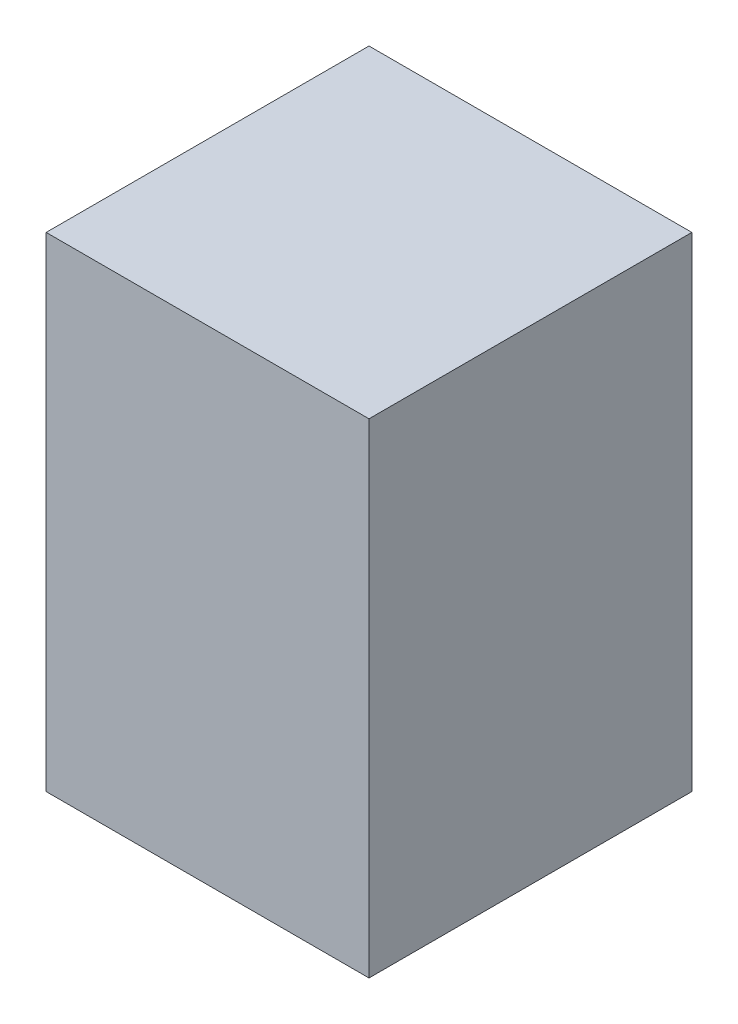
ISO-10303-21;
HEADER;
FILE_DESCRIPTION(('STEP AP214'),'2;1');
FILE_NAME('part.step','',(''),(''),'','','');
FILE_SCHEMA(('AUTOMOTIVE_DESIGN { 1 0 10303 214 1 1 1 1 }'));
ENDSEC;
DATA;
#1=APPLICATION_CONTEXT('core data for automotive mechanical design processes');
#2=APPLICATION_PROTOCOL_DEFINITION('international standard','automotive_design',2000,#1);
#3=PRODUCT_CONTEXT('',#1,'mechanical');
#4=PRODUCT('Part','Part','',(#3));
#5=PRODUCT_RELATED_PRODUCT_CATEGORY('part','',(#4));
#6=PRODUCT_DEFINITION_FORMATION('','',#4);
#7=PRODUCT_DEFINITION_CONTEXT('part definition',#1,'design');
#8=PRODUCT_DEFINITION('design','',#6,#7);
#9=PRODUCT_DEFINITION_SHAPE('','',#8);
#10=(LENGTH_UNIT() NAMED_UNIT(*) SI_UNIT(.MILLI.,.METRE.));
#11=(NAMED_UNIT(*) PLANE_ANGLE_UNIT() SI_UNIT($,.RADIAN.));
#12=(NAMED_UNIT(*) SI_UNIT($,.STERADIAN.) SOLID_ANGLE_UNIT());
#13=UNCERTAINTY_MEASURE_WITH_UNIT(LENGTH_MEASURE(1.E-05),#10,'distance_accuracy_value','');
#14=(GEOMETRIC_REPRESENTATION_CONTEXT(3) GLOBAL_UNCERTAINTY_ASSIGNED_CONTEXT((#13)) GLOBAL_UNIT_ASSIGNED_CONTEXT((#10,
#11,#12)) REPRESENTATION_CONTEXT('',''));
#15=CARTESIAN_POINT('',(0.,0.,0.));
#16=DIRECTION('',(0.,0.,1.));
#17=DIRECTION('',(1.,0.,0.));
#18=AXIS2_PLACEMENT_3D('',#15,#16,#17);
#19=CARTESIAN_POINT('',(488.,738.,488.));
#20=DIRECTION('',(1.,0.,0.));
#21=DIRECTION('',(0.,1.,0.));
#22=AXIS2_PLACEMENT_3D('',#19,#20,#21);
#23=PLANE('',#22);
#24=DIRECTION('',(0.,-1.,0.));
#25=VECTOR('',#24,1.);
#26=CARTESIAN_POINT('',(488.,738.,0.));
#27=LINE('',#26,#25);
#28=CARTESIAN_POINT('',(488.,738.,0.));
#29=VERTEX_POINT('',#28);
#30=CARTESIAN_POINT('',(488.,507.,0.));
#31=VERTEX_POINT('',#30);
#32=EDGE_CURVE('E323',#29,#31,#27,.T.);
#33=ORIENTED_EDGE('',*,*,#32,.T.);
#34=DIRECTION('',(0.,0.,-1.));
#35=VECTOR('',#34,1.);
#36=CARTESIAN_POINT('',(488.,507.,488.));
#37=LINE('',#36,#35);
#38=CARTESIAN_POINT('',(488.,507.,488.));
#39=VERTEX_POINT('',#38);
#40=EDGE_CURVE('E234',#39,#31,#37,.T.);
#41=ORIENTED_EDGE('',*,*,#40,.F.);
#42=DIRECTION('',(0.,-1.,0.));
#43=VECTOR('',#42,1.);
#44=CARTESIAN_POINT('',(488.,738.,488.));
#45=LINE('',#44,#43);
#46=CARTESIAN_POINT('',(488.,738.,488.));
#47=VERTEX_POINT('',#46);
#48=EDGE_CURVE('E307',#47,#39,#45,.T.);
#49=ORIENTED_EDGE('',*,*,#48,.F.);
#50=DIRECTION('',(0.,0.,-1.));
#51=VECTOR('',#50,1.);
#52=CARTESIAN_POINT('',(488.,738.,488.));
#53=LINE('',#52,#51);
#54=EDGE_CURVE('E338',#47,#29,#53,.T.);
#55=ORIENTED_EDGE('',*,*,#54,.T.);
#56=EDGE_LOOP('',(#33,#41,#49,#55));
#57=FACE_BOUND('',#56,.T.);
#58=ADVANCED_FACE('F36',(#57),#23,.F.);
#59=CARTESIAN_POINT('',(488.,493.,488.));
#60=VERTEX_POINT('',#59);
#61=CARTESIAN_POINT('',(488.,257.,488.));
#62=VERTEX_POINT('',#61);
#63=EDGE_CURVE('E310',#60,#62,#45,.T.);
#64=ORIENTED_EDGE('',*,*,#63,.F.);
#65=DIRECTION('',(0.,0.,-1.));
#66=VECTOR('',#65,1.);
#67=CARTESIAN_POINT('',(488.,493.,488.));
#68=LINE('',#67,#66);
#69=CARTESIAN_POINT('',(488.,493.,0.));
#70=VERTEX_POINT('',#69);
#71=EDGE_CURVE('E209',#60,#70,#68,.T.);
#72=ORIENTED_EDGE('',*,*,#71,.T.);
#73=CARTESIAN_POINT('',(488.,257.,0.));
#74=VERTEX_POINT('',#73);
#75=EDGE_CURVE('E327',#70,#74,#27,.T.);
#76=ORIENTED_EDGE('',*,*,#75,.T.);
#77=DIRECTION('',(0.,0.,-1.));
#78=VECTOR('',#77,1.);
#79=CARTESIAN_POINT('',(488.,257.,488.));
#80=LINE('',#79,#78);
#81=EDGE_CURVE('E301',#62,#74,#80,.T.);
#82=ORIENTED_EDGE('',*,*,#81,.F.);
#83=EDGE_LOOP('',(#64,#72,#76,#82));
#84=FACE_BOUND('',#83,.T.);
#85=ADVANCED_FACE('F403',(#84),#23,.F.);
#86=CARTESIAN_POINT('',(12.,738.,488.));
#87=DIRECTION('',(-1.,0.,0.));
#88=DIRECTION('',(0.,-1.,0.));
#89=AXIS2_PLACEMENT_3D('',#86,#87,#88);
#90=PLANE('',#89);
#91=DIRECTION('',(0.,1.,0.));
#92=VECTOR('',#91,1.);
#93=CARTESIAN_POINT('',(12.,738.,488.));
#94=LINE('',#93,#92);
#95=CARTESIAN_POINT('',(11.9999999999999,257.,488.));
#96=VERTEX_POINT('',#95);
#97=CARTESIAN_POINT('',(11.9999999999999,493.,488.));
#98=VERTEX_POINT('',#97);
#99=EDGE_CURVE('E319',#96,#98,#94,.T.);
#100=ORIENTED_EDGE('',*,*,#99,.F.);
#101=DIRECTION('',(0.,0.,-1.));
#102=VECTOR('',#101,1.);
#103=CARTESIAN_POINT('',(11.9999999999999,257.,488.));
#104=LINE('',#103,#102);
#105=CARTESIAN_POINT('',(11.9999999999999,257.,0.));
#106=VERTEX_POINT('',#105);
#107=EDGE_CURVE('E249',#96,#106,#104,.T.);
#108=ORIENTED_EDGE('',*,*,#107,.T.);
#109=DIRECTION('',(0.,1.,0.));
#110=VECTOR('',#109,1.);
#111=CARTESIAN_POINT('',(12.,738.,0.));
#112=LINE('',#111,#110);
#113=CARTESIAN_POINT('',(11.9999999999999,493.,0.));
#114=VERTEX_POINT('',#113);
#115=EDGE_CURVE('E335',#106,#114,#112,.T.);
#116=ORIENTED_EDGE('',*,*,#115,.T.);
#117=DIRECTION('',(0.,0.,-1.));
#118=VECTOR('',#117,1.);
#119=CARTESIAN_POINT('',(11.9999999999999,493.,488.));
#120=LINE('',#119,#118);
#121=EDGE_CURVE('E244',#98,#114,#120,.T.);
#122=ORIENTED_EDGE('',*,*,#121,.F.);
#123=EDGE_LOOP('',(#100,#108,#116,#122));
#124=FACE_BOUND('',#123,.T.);
#125=ADVANCED_FACE('F398',(#124),#90,.F.);
#126=CARTESIAN_POINT('',(12.,507.,488.));
#127=VERTEX_POINT('',#126);
#128=CARTESIAN_POINT('',(12.,738.,488.));
#129=VERTEX_POINT('',#128);
#130=EDGE_CURVE('E314',#127,#129,#94,.T.);
#131=ORIENTED_EDGE('',*,*,#130,.F.);
#132=DIRECTION('',(0.,0.,-1.));
#133=VECTOR('',#132,1.);
#134=CARTESIAN_POINT('',(11.9999999999999,507.,488.));
#135=LINE('',#134,#133);
#136=CARTESIAN_POINT('',(11.9999999999999,507.,0.));
#137=VERTEX_POINT('',#136);
#138=EDGE_CURVE('E229',#127,#137,#135,.T.);
#139=ORIENTED_EDGE('',*,*,#138,.T.);
#140=CARTESIAN_POINT('',(12.,738.,0.));
#141=VERTEX_POINT('',#140);
#142=EDGE_CURVE('E330',#137,#141,#112,.T.);
#143=ORIENTED_EDGE('',*,*,#142,.T.);
#144=DIRECTION('',(0.,0.,-1.));
#145=VECTOR('',#144,1.);
#146=CARTESIAN_POINT('',(12.,738.,488.));
#147=LINE('',#146,#145);
#148=EDGE_CURVE('E341',#129,#141,#147,.T.);
#149=ORIENTED_EDGE('',*,*,#148,.F.);
#150=EDGE_LOOP('',(#131,#139,#143,#149));
#151=FACE_BOUND('',#150,.T.);
#152=ADVANCED_FACE('F393',(#151),#90,.F.);
#153=CARTESIAN_POINT('',(0.,0.,500.));
#154=DIRECTION('',(0.,1.,0.));
#155=DIRECTION('',(0.,0.,1.));
#156=AXIS2_PLACEMENT_3D('',#153,#154,#155);
#157=PLANE('',#156);
#158=DIRECTION('',(1.,0.,0.));
#159=VECTOR('',#158,1.);
#160=CARTESIAN_POINT('',(0.,0.,0.));
#161=LINE('',#160,#159);
#162=CARTESIAN_POINT('',(0.,0.,0.));
#163=VERTEX_POINT('',#162);
#164=CARTESIAN_POINT('',(500.,0.,0.));
#165=VERTEX_POINT('',#164);
#166=EDGE_CURVE('E340',#163,#165,#161,.T.);
#167=ORIENTED_EDGE('',*,*,#166,.T.);
#168=DIRECTION('',(0.,0.,-1.));
#169=VECTOR('',#168,1.);
#170=CARTESIAN_POINT('',(500.,0.,500.));
#171=LINE('',#170,#169);
#172=CARTESIAN_POINT('',(500.,0.,500.));
#173=VERTEX_POINT('',#172);
#174=EDGE_CURVE('E11',#173,#165,#171,.T.);
#175=ORIENTED_EDGE('',*,*,#174,.F.);
#176=DIRECTION('',(1.,0.,0.));
#177=VECTOR('',#176,1.);
#178=CARTESIAN_POINT('',(0.,0.,500.));
#179=LINE('',#178,#177);
#180=CARTESIAN_POINT('',(0.,0.,500.));
#181=VERTEX_POINT('',#180);
#182=EDGE_CURVE('E348',#181,#173,#179,.T.);
#183=ORIENTED_EDGE('',*,*,#182,.F.);
#184=DIRECTION('',(0.,0.,-1.));
#185=VECTOR('',#184,1.);
#186=CARTESIAN_POINT('',(0.,0.,500.));
#187=LINE('',#186,#185);
#188=EDGE_CURVE('E360',#181,#163,#187,.T.);
#189=ORIENTED_EDGE('',*,*,#188,.T.);
#190=EDGE_LOOP('',(#167,#175,#183,#189));
#191=FACE_BOUND('',#190,.T.);
#192=ADVANCED_FACE('F38',(#191),#157,.F.);
#193=CARTESIAN_POINT('',(500.,0.,500.));
#194=DIRECTION('',(-1.,0.,0.));
#195=DIRECTION('',(0.,-1.,0.));
#196=AXIS2_PLACEMENT_3D('',#193,#194,#195);
#197=PLANE('',#196);
#198=DIRECTION('',(0.,1.,0.));
#199=VECTOR('',#198,1.);
#200=CARTESIAN_POINT('',(500.,0.,0.));
#201=LINE('',#200,#199);
#202=CARTESIAN_POINT('',(500.,750.,0.));
#203=VERTEX_POINT('',#202);
#204=EDGE_CURVE('E363',#165,#203,#201,.T.);
#205=ORIENTED_EDGE('',*,*,#204,.T.);
#206=DIRECTION('',(0.,0.,-1.));
#207=VECTOR('',#206,1.);
#208=CARTESIAN_POINT('',(500.,750.,500.));
#209=LINE('',#208,#207);
#210=CARTESIAN_POINT('',(500.,750.,500.));
#211=VERTEX_POINT('',#210);
#212=EDGE_CURVE('E44',#211,#203,#209,.T.);
#213=ORIENTED_EDGE('',*,*,#212,.F.);
#214=DIRECTION('',(0.,1.,0.));
#215=VECTOR('',#214,1.);
#216=CARTESIAN_POINT('',(500.,0.,500.));
#217=LINE('',#216,#215);
#218=EDGE_CURVE('E351',#173,#211,#217,.T.);
#219=ORIENTED_EDGE('',*,*,#218,.F.);
#220=ORIENTED_EDGE('',*,*,#174,.T.);
#221=EDGE_LOOP('',(#205,#213,#219,#220));
#222=FACE_BOUND('',#221,.T.);
#223=ADVANCED_FACE('F379',(#222),#197,.F.);
#224=CARTESIAN_POINT('',(0.,750.,500.));
#225=DIRECTION('',(0.,1.,0.));
#226=DIRECTION('',(0.,0.,1.));
#227=AXIS2_PLACEMENT_3D('',#224,#225,#226);
#228=PLANE('',#227);
#229=DIRECTION('',(1.,0.,0.));
#230=VECTOR('',#229,1.);
#231=CARTESIAN_POINT('',(0.,750.,0.));
#232=LINE('',#231,#230);
#233=CARTESIAN_POINT('',(0.,750.,0.));
#234=VERTEX_POINT('',#233);
#235=EDGE_CURVE('E366',#234,#203,#232,.T.);
#236=ORIENTED_EDGE('',*,*,#235,.F.);
#237=DIRECTION('',(0.,0.,-1.));
#238=VECTOR('',#237,1.);
#239=CARTESIAN_POINT('',(0.,750.,500.));
#240=LINE('',#239,#238);
#241=CARTESIAN_POINT('',(0.,750.,500.));
#242=VERTEX_POINT('',#241);
#243=EDGE_CURVE('E372',#242,#234,#240,.T.);
#244=ORIENTED_EDGE('',*,*,#243,.F.);
#245=DIRECTION('',(1.,0.,0.));
#246=VECTOR('',#245,1.);
#247=CARTESIAN_POINT('',(0.,750.,500.));
#248=LINE('',#247,#246);
#249=EDGE_CURVE('E354',#242,#211,#248,.T.);
#250=ORIENTED_EDGE('',*,*,#249,.T.);
#251=ORIENTED_EDGE('',*,*,#212,.T.);
#252=EDGE_LOOP('',(#236,#244,#250,#251));
#253=FACE_BOUND('',#252,.T.);
#254=ADVANCED_FACE('F376',(#253),#228,.T.);
#255=CARTESIAN_POINT('',(0.,0.,500.));
#256=DIRECTION('',(-1.,0.,0.));
#257=DIRECTION('',(0.,0.,1.));
#258=AXIS2_PLACEMENT_3D('',#255,#256,#257);
#259=PLANE('',#258);
#260=DIRECTION('',(0.,1.,0.));
#261=VECTOR('',#260,1.);
#262=CARTESIAN_POINT('',(0.,0.,0.));
#263=LINE('',#262,#261);
#264=EDGE_CURVE('E352',#163,#234,#263,.T.);
#265=ORIENTED_EDGE('',*,*,#264,.F.);
#266=ORIENTED_EDGE('',*,*,#188,.F.);
#267=DIRECTION('',(0.,1.,0.));
#268=VECTOR('',#267,1.);
#269=CARTESIAN_POINT('',(0.,0.,500.));
#270=LINE('',#269,#268);
#271=EDGE_CURVE('E357',#181,#242,#270,.T.);
#272=ORIENTED_EDGE('',*,*,#271,.T.);
#273=ORIENTED_EDGE('',*,*,#243,.T.);
#274=EDGE_LOOP('',(#265,#266,#272,#273));
#275=FACE_BOUND('',#274,.T.);
#276=ADVANCED_FACE('F386',(#275),#259,.T.);
#277=CARTESIAN_POINT('',(0.,0.,500.));
#278=DIRECTION('',(0.,0.,1.));
#279=DIRECTION('',(1.,0.,0.));
#280=AXIS2_PLACEMENT_3D('',#277,#278,#279);
#281=PLANE('',#280);
#282=ORIENTED_EDGE('',*,*,#182,.T.);
#283=ORIENTED_EDGE('',*,*,#218,.T.);
#284=ORIENTED_EDGE('',*,*,#249,.F.);
#285=ORIENTED_EDGE('',*,*,#271,.F.);
#286=EDGE_LOOP('',(#282,#283,#284,#285));
#287=FACE_BOUND('',#286,.T.);
#288=ADVANCED_FACE('F390',(#287),#281,.T.);
#289=CARTESIAN_POINT('',(0.,0.,0.));
#290=DIRECTION('',(0.,0.,1.));
#291=DIRECTION('',(1.,0.,0.));
#292=AXIS2_PLACEMENT_3D('',#289,#290,#291);
#293=PLANE('',#292);
#294=ORIENTED_EDGE('',*,*,#115,.F.);
#295=DIRECTION('',(1.,0.,0.));
#296=VECTOR('',#295,1.);
#297=CARTESIAN_POINT('',(11.9999999999999,257.,0.));
#298=LINE('',#297,#296);
#299=CARTESIAN_POINT('',(5.99999999999988,257.,0.));
#300=VERTEX_POINT('',#299);
#301=EDGE_CURVE('E264',#300,#106,#298,.T.);
#302=ORIENTED_EDGE('',*,*,#301,.F.);
#303=DIRECTION('',(0.,1.,0.));
#304=VECTOR('',#303,1.);
#305=CARTESIAN_POINT('',(5.99999999999988,257.,0.));
#306=LINE('',#305,#304);
#307=CARTESIAN_POINT('',(5.99999999999988,243.,0.));
#308=VERTEX_POINT('',#307);
#309=EDGE_CURVE('E271',#308,#300,#306,.T.);
#310=ORIENTED_EDGE('',*,*,#309,.F.);
#311=DIRECTION('',(-1.,0.,0.));
#312=VECTOR('',#311,1.);
#313=CARTESIAN_POINT('',(11.9999999999999,243.,0.));
#314=LINE('',#313,#312);
#315=CARTESIAN_POINT('',(11.9999999999999,243.,0.));
#316=VERTEX_POINT('',#315);
#317=EDGE_CURVE('E268',#316,#308,#314,.T.);
#318=ORIENTED_EDGE('',*,*,#317,.F.);
#319=CARTESIAN_POINT('',(11.9999999999999,12.,0.));
#320=VERTEX_POINT('',#319);
#321=EDGE_CURVE('E331',#320,#316,#112,.T.);
#322=ORIENTED_EDGE('',*,*,#321,.F.);
#323=DIRECTION('',(-1.,0.,0.));
#324=VECTOR('',#323,1.);
#325=CARTESIAN_POINT('',(488.,12.,0.));
#326=LINE('',#325,#324);
#327=CARTESIAN_POINT('',(488.,12.,0.));
#328=VERTEX_POINT('',#327);
#329=EDGE_CURVE('E326',#328,#320,#326,.T.);
#330=ORIENTED_EDGE('',*,*,#329,.F.);
#331=CARTESIAN_POINT('',(488.,243.,0.));
#332=VERTEX_POINT('',#331);
#333=EDGE_CURVE('E300',#332,#328,#27,.T.);
#334=ORIENTED_EDGE('',*,*,#333,.F.);
#335=DIRECTION('',(-1.,0.,0.));
#336=VECTOR('',#335,1.);
#337=CARTESIAN_POINT('',(494.,243.,0.));
#338=LINE('',#337,#336);
#339=CARTESIAN_POINT('',(494.,243.,0.));
#340=VERTEX_POINT('',#339);
#341=EDGE_CURVE('E294',#340,#332,#338,.T.);
#342=ORIENTED_EDGE('',*,*,#341,.F.);
#343=DIRECTION('',(0.,-1.,0.));
#344=VECTOR('',#343,1.);
#345=CARTESIAN_POINT('',(494.,257.,0.));
#346=LINE('',#345,#344);
#347=CARTESIAN_POINT('',(494.,257.,0.));
#348=VERTEX_POINT('',#347);
#349=EDGE_CURVE('E233',#348,#340,#346,.T.);
#350=ORIENTED_EDGE('',*,*,#349,.F.);
#351=DIRECTION('',(1.,0.,0.));
#352=VECTOR('',#351,1.);
#353=CARTESIAN_POINT('',(494.,257.,0.));
#354=LINE('',#353,#352);
#355=EDGE_CURVE('E286',#74,#348,#354,.T.);
#356=ORIENTED_EDGE('',*,*,#355,.F.);
#357=ORIENTED_EDGE('',*,*,#75,.F.);
#358=DIRECTION('',(-1.,0.,0.));
#359=VECTOR('',#358,1.);
#360=CARTESIAN_POINT('',(494.,493.,0.));
#361=LINE('',#360,#359);
#362=CARTESIAN_POINT('',(494.,493.,0.));
#363=VERTEX_POINT('',#362);
#364=EDGE_CURVE('E224',#363,#70,#361,.T.);
#365=ORIENTED_EDGE('',*,*,#364,.F.);
#366=DIRECTION('',(0.,-1.,0.));
#367=VECTOR('',#366,1.);
#368=CARTESIAN_POINT('',(494.,507.,0.));
#369=LINE('',#368,#367);
#370=CARTESIAN_POINT('',(494.,507.,0.));
#371=VERTEX_POINT('',#370);
#372=EDGE_CURVE('E206',#371,#363,#369,.T.);
#373=ORIENTED_EDGE('',*,*,#372,.F.);
#374=DIRECTION('',(1.,0.,0.));
#375=VECTOR('',#374,1.);
#376=CARTESIAN_POINT('',(494.,507.,0.));
#377=LINE('',#376,#375);
#378=EDGE_CURVE('E221',#31,#371,#377,.T.);
#379=ORIENTED_EDGE('',*,*,#378,.F.);
#380=ORIENTED_EDGE('',*,*,#32,.F.);
#381=DIRECTION('',(1.,0.,0.));
#382=VECTOR('',#381,1.);
#383=CARTESIAN_POINT('',(488.,738.,0.));
#384=LINE('',#383,#382);
#385=EDGE_CURVE('E334',#141,#29,#384,.T.);
#386=ORIENTED_EDGE('',*,*,#385,.F.);
#387=ORIENTED_EDGE('',*,*,#142,.F.);
#388=DIRECTION('',(1.,0.,0.));
#389=VECTOR('',#388,1.);
#390=CARTESIAN_POINT('',(11.9999999999999,507.,0.));
#391=LINE('',#390,#389);
#392=CARTESIAN_POINT('',(5.99999999999991,507.,0.));
#393=VERTEX_POINT('',#392);
#394=EDGE_CURVE('E241',#393,#137,#391,.T.);
#395=ORIENTED_EDGE('',*,*,#394,.F.);
#396=DIRECTION('',(0.,1.,0.));
#397=VECTOR('',#396,1.);
#398=CARTESIAN_POINT('',(5.99999999999991,507.,0.));
#399=LINE('',#398,#397);
#400=CARTESIAN_POINT('',(5.9999999999999,493.,0.));
#401=VERTEX_POINT('',#400);
#402=EDGE_CURVE('E248',#401,#393,#399,.T.);
#403=ORIENTED_EDGE('',*,*,#402,.F.);
#404=DIRECTION('',(-1.,0.,0.));
#405=VECTOR('',#404,1.);
#406=CARTESIAN_POINT('',(11.9999999999999,493.,0.));
#407=LINE('',#406,#405);
#408=EDGE_CURVE('E245',#114,#401,#407,.T.);
#409=ORIENTED_EDGE('',*,*,#408,.F.);
#410=EDGE_LOOP('',(#294,#302,#310,#318,#322,#330,#334,#342,#350,#356,#357,#365,#373,#379,#380,
#386,#387,#395,#403,#409));
#411=FACE_BOUND('',#410,.T.);
#412=ORIENTED_EDGE('',*,*,#166,.F.);
#413=ORIENTED_EDGE('',*,*,#264,.T.);
#414=ORIENTED_EDGE('',*,*,#235,.T.);
#415=ORIENTED_EDGE('',*,*,#204,.F.);
#416=EDGE_LOOP('',(#412,#413,#414,#415));
#417=FACE_BOUND('',#416,.T.);
#418=ADVANCED_FACE('F383',(#411,#417),#293,.F.);
#419=CARTESIAN_POINT('',(488.,243.,488.));
#420=VERTEX_POINT('',#419);
#421=CARTESIAN_POINT('',(488.,12.,488.));
#422=VERTEX_POINT('',#421);
#423=EDGE_CURVE('E311',#420,#422,#45,.T.);
#424=ORIENTED_EDGE('',*,*,#423,.F.);
#425=DIRECTION('',(0.,0.,-1.));
#426=VECTOR('',#425,1.);
#427=CARTESIAN_POINT('',(488.,243.,488.));
#428=LINE('',#427,#426);
#429=EDGE_CURVE('E303',#420,#332,#428,.T.);
#430=ORIENTED_EDGE('',*,*,#429,.T.);
#431=ORIENTED_EDGE('',*,*,#333,.T.);
#432=DIRECTION('',(0.,0.,-1.));
#433=VECTOR('',#432,1.);
#434=CARTESIAN_POINT('',(488.,12.,488.));
#435=LINE('',#434,#433);
#436=EDGE_CURVE('E322',#422,#328,#435,.T.);
#437=ORIENTED_EDGE('',*,*,#436,.F.);
#438=EDGE_LOOP('',(#424,#430,#431,#437));
#439=FACE_BOUND('',#438,.T.);
#440=ADVANCED_FACE('F406',(#439),#23,.F.);
#441=CARTESIAN_POINT('',(488.,738.,488.));
#442=DIRECTION('',(0.,1.,0.));
#443=DIRECTION('',(0.,0.,1.));
#444=AXIS2_PLACEMENT_3D('',#441,#442,#443);
#445=PLANE('',#444);
#446=ORIENTED_EDGE('',*,*,#385,.T.);
#447=ORIENTED_EDGE('',*,*,#54,.F.);
#448=DIRECTION('',(1.,0.,0.));
#449=VECTOR('',#448,1.);
#450=CARTESIAN_POINT('',(488.,738.,488.));
#451=LINE('',#450,#449);
#452=EDGE_CURVE('E318',#129,#47,#451,.T.);
#453=ORIENTED_EDGE('',*,*,#452,.F.);
#454=ORIENTED_EDGE('',*,*,#148,.T.);
#455=EDGE_LOOP('',(#446,#447,#453,#454));
#456=FACE_BOUND('',#455,.T.);
#457=ADVANCED_FACE('F414',(#456),#445,.F.);
#458=ORIENTED_EDGE('',*,*,#321,.T.);
#459=DIRECTION('',(0.,0.,-1.));
#460=VECTOR('',#459,1.);
#461=CARTESIAN_POINT('',(11.9999999999999,243.,488.));
#462=LINE('',#461,#460);
#463=CARTESIAN_POINT('',(11.9999999999999,243.,488.));
#464=VERTEX_POINT('',#463);
#465=EDGE_CURVE('E267',#464,#316,#462,.T.);
#466=ORIENTED_EDGE('',*,*,#465,.F.);
#467=CARTESIAN_POINT('',(11.9999999999999,12.,488.));
#468=VERTEX_POINT('',#467);
#469=EDGE_CURVE('E315',#468,#464,#94,.T.);
#470=ORIENTED_EDGE('',*,*,#469,.F.);
#471=DIRECTION('',(0.,0.,-1.));
#472=VECTOR('',#471,1.);
#473=CARTESIAN_POINT('',(11.9999999999999,12.,488.));
#474=LINE('',#473,#472);
#475=EDGE_CURVE('E344',#468,#320,#474,.T.);
#476=ORIENTED_EDGE('',*,*,#475,.T.);
#477=EDGE_LOOP('',(#458,#466,#470,#476));
#478=FACE_BOUND('',#477,.T.);
#479=ADVANCED_FACE('F401',(#478),#90,.F.);
#480=CARTESIAN_POINT('',(488.,12.,488.));
#481=DIRECTION('',(0.,-1.,0.));
#482=DIRECTION('',(0.,0.,-1.));
#483=AXIS2_PLACEMENT_3D('',#480,#481,#482);
#484=PLANE('',#483);
#485=ORIENTED_EDGE('',*,*,#329,.T.);
#486=ORIENTED_EDGE('',*,*,#475,.F.);
#487=DIRECTION('',(-1.,0.,0.));
#488=VECTOR('',#487,1.);
#489=CARTESIAN_POINT('',(488.,12.,488.));
#490=LINE('',#489,#488);
#491=EDGE_CURVE('E309',#422,#468,#490,.T.);
#492=ORIENTED_EDGE('',*,*,#491,.F.);
#493=ORIENTED_EDGE('',*,*,#436,.T.);
#494=EDGE_LOOP('',(#485,#486,#492,#493));
#495=FACE_BOUND('',#494,.T.);
#496=ADVANCED_FACE('F458',(#495),#484,.F.);
#497=CARTESIAN_POINT('',(0.,0.,488.));
#498=DIRECTION('',(0.,0.,-1.));
#499=DIRECTION('',(-1.,0.,0.));
#500=AXIS2_PLACEMENT_3D('',#497,#498,#499);
#501=PLANE('',#500);
#502=ORIENTED_EDGE('',*,*,#48,.T.);
#503=DIRECTION('',(1.,0.,0.));
#504=VECTOR('',#503,1.);
#505=CARTESIAN_POINT('',(494.,507.,488.));
#506=LINE('',#505,#504);
#507=CARTESIAN_POINT('',(494.,507.,488.));
#508=VERTEX_POINT('',#507);
#509=EDGE_CURVE('E210',#39,#508,#506,.T.);
#510=ORIENTED_EDGE('',*,*,#509,.T.);
#511=DIRECTION('',(0.,-1.,0.));
#512=VECTOR('',#511,1.);
#513=CARTESIAN_POINT('',(494.,507.,488.));
#514=LINE('',#513,#512);
#515=CARTESIAN_POINT('',(494.,493.,488.));
#516=VERTEX_POINT('',#515);
#517=EDGE_CURVE('E203',#508,#516,#514,.T.);
#518=ORIENTED_EDGE('',*,*,#517,.T.);
#519=DIRECTION('',(-1.,0.,0.));
#520=VECTOR('',#519,1.);
#521=CARTESIAN_POINT('',(494.,493.,488.));
#522=LINE('',#521,#520);
#523=EDGE_CURVE('E213',#516,#60,#522,.T.);
#524=ORIENTED_EDGE('',*,*,#523,.T.);
#525=ORIENTED_EDGE('',*,*,#63,.T.);
#526=DIRECTION('',(1.,0.,0.));
#527=VECTOR('',#526,1.);
#528=CARTESIAN_POINT('',(494.,257.,488.));
#529=LINE('',#528,#527);
#530=CARTESIAN_POINT('',(494.,257.,488.));
#531=VERTEX_POINT('',#530);
#532=EDGE_CURVE('E288',#62,#531,#529,.T.);
#533=ORIENTED_EDGE('',*,*,#532,.T.);
#534=DIRECTION('',(0.,-1.,0.));
#535=VECTOR('',#534,1.);
#536=CARTESIAN_POINT('',(494.,257.,488.));
#537=LINE('',#536,#535);
#538=CARTESIAN_POINT('',(494.,243.,488.));
#539=VERTEX_POINT('',#538);
#540=EDGE_CURVE('E282',#531,#539,#537,.T.);
#541=ORIENTED_EDGE('',*,*,#540,.T.);
#542=DIRECTION('',(-1.,0.,0.));
#543=VECTOR('',#542,1.);
#544=CARTESIAN_POINT('',(494.,243.,488.));
#545=LINE('',#544,#543);
#546=EDGE_CURVE('E285',#539,#420,#545,.T.);
#547=ORIENTED_EDGE('',*,*,#546,.T.);
#548=ORIENTED_EDGE('',*,*,#423,.T.);
#549=ORIENTED_EDGE('',*,*,#491,.T.);
#550=ORIENTED_EDGE('',*,*,#469,.T.);
#551=DIRECTION('',(-1.,0.,0.));
#552=VECTOR('',#551,1.);
#553=CARTESIAN_POINT('',(11.9999999999999,243.,488.));
#554=LINE('',#553,#552);
#555=CARTESIAN_POINT('',(5.99999999999988,243.,488.));
#556=VERTEX_POINT('',#555);
#557=EDGE_CURVE('E260',#464,#556,#554,.T.);
#558=ORIENTED_EDGE('',*,*,#557,.T.);
#559=DIRECTION('',(0.,1.,0.));
#560=VECTOR('',#559,1.);
#561=CARTESIAN_POINT('',(5.99999999999988,257.,488.));
#562=LINE('',#561,#560);
#563=CARTESIAN_POINT('',(5.99999999999988,257.,488.));
#564=VERTEX_POINT('',#563);
#565=EDGE_CURVE('E263',#556,#564,#562,.T.);
#566=ORIENTED_EDGE('',*,*,#565,.T.);
#567=DIRECTION('',(1.,0.,0.));
#568=VECTOR('',#567,1.);
#569=CARTESIAN_POINT('',(11.9999999999999,257.,488.));
#570=LINE('',#569,#568);
#571=EDGE_CURVE('E58',#564,#96,#570,.T.);
#572=ORIENTED_EDGE('',*,*,#571,.T.);
#573=ORIENTED_EDGE('',*,*,#99,.T.);
#574=DIRECTION('',(-1.,0.,0.));
#575=VECTOR('',#574,1.);
#576=CARTESIAN_POINT('',(11.9999999999999,493.,488.));
#577=LINE('',#576,#575);
#578=CARTESIAN_POINT('',(5.9999999999999,493.,488.));
#579=VERTEX_POINT('',#578);
#580=EDGE_CURVE('E237',#98,#579,#577,.T.);
#581=ORIENTED_EDGE('',*,*,#580,.T.);
#582=DIRECTION('',(0.,1.,0.));
#583=VECTOR('',#582,1.);
#584=CARTESIAN_POINT('',(5.99999999999991,507.,488.));
#585=LINE('',#584,#583);
#586=CARTESIAN_POINT('',(5.99999999999991,507.,488.));
#587=VERTEX_POINT('',#586);
#588=EDGE_CURVE('E240',#579,#587,#585,.T.);
#589=ORIENTED_EDGE('',*,*,#588,.T.);
#590=DIRECTION('',(1.,0.,0.));
#591=VECTOR('',#590,1.);
#592=CARTESIAN_POINT('',(11.9999999999999,507.,488.));
#593=LINE('',#592,#591);
#594=EDGE_CURVE('E51',#587,#127,#593,.T.);
#595=ORIENTED_EDGE('',*,*,#594,.T.);
#596=ORIENTED_EDGE('',*,*,#130,.T.);
#597=ORIENTED_EDGE('',*,*,#452,.T.);
#598=EDGE_LOOP('',(#502,#510,#518,#524,#525,#533,#541,#547,#548,#549,#550,#558,#566,#572,#573,
#581,#589,#595,#596,#597));
#599=FACE_BOUND('',#598,.T.);
#600=ADVANCED_FACE('F220',(#599),#501,.T.);
#601=CARTESIAN_POINT('',(494.,257.,488.));
#602=DIRECTION('',(1.,0.,0.));
#603=DIRECTION('',(0.,0.,-1.));
#604=AXIS2_PLACEMENT_3D('',#601,#602,#603);
#605=PLANE('',#604);
#606=ORIENTED_EDGE('',*,*,#349,.T.);
#607=DIRECTION('',(0.,0.,-1.));
#608=VECTOR('',#607,1.);
#609=CARTESIAN_POINT('',(494.,243.,488.));
#610=LINE('',#609,#608);
#611=EDGE_CURVE('E291',#539,#340,#610,.T.);
#612=ORIENTED_EDGE('',*,*,#611,.F.);
#613=ORIENTED_EDGE('',*,*,#540,.F.);
#614=DIRECTION('',(0.,0.,-1.));
#615=VECTOR('',#614,1.);
#616=CARTESIAN_POINT('',(494.,257.,488.));
#617=LINE('',#616,#615);
#618=EDGE_CURVE('E298',#531,#348,#617,.T.);
#619=ORIENTED_EDGE('',*,*,#618,.T.);
#620=EDGE_LOOP('',(#606,#612,#613,#619));
#621=FACE_BOUND('',#620,.T.);
#622=ADVANCED_FACE('F439',(#621),#605,.F.);
#623=CARTESIAN_POINT('',(494.,257.,488.));
#624=DIRECTION('',(0.,1.,0.));
#625=DIRECTION('',(0.,0.,1.));
#626=AXIS2_PLACEMENT_3D('',#623,#624,#625);
#627=PLANE('',#626);
#628=ORIENTED_EDGE('',*,*,#355,.T.);
#629=ORIENTED_EDGE('',*,*,#618,.F.);
#630=ORIENTED_EDGE('',*,*,#532,.F.);
#631=ORIENTED_EDGE('',*,*,#81,.T.);
#632=EDGE_LOOP('',(#628,#629,#630,#631));
#633=FACE_BOUND('',#632,.T.);
#634=ADVANCED_FACE('F434',(#633),#627,.F.);
#635=CARTESIAN_POINT('',(494.,243.,488.));
#636=DIRECTION('',(0.,-1.,0.));
#637=DIRECTION('',(0.,0.,-1.));
#638=AXIS2_PLACEMENT_3D('',#635,#636,#637);
#639=PLANE('',#638);
#640=ORIENTED_EDGE('',*,*,#341,.T.);
#641=ORIENTED_EDGE('',*,*,#429,.F.);
#642=ORIENTED_EDGE('',*,*,#546,.F.);
#643=ORIENTED_EDGE('',*,*,#611,.T.);
#644=EDGE_LOOP('',(#640,#641,#642,#643));
#645=FACE_BOUND('',#644,.T.);
#646=ADVANCED_FACE('F443',(#645),#639,.F.);
#647=CARTESIAN_POINT('',(494.,507.,488.));
#648=DIRECTION('',(1.,0.,0.));
#649=DIRECTION('',(0.,0.,-1.));
#650=AXIS2_PLACEMENT_3D('',#647,#648,#649);
#651=PLANE('',#650);
#652=ORIENTED_EDGE('',*,*,#372,.T.);
#653=DIRECTION('',(0.,0.,-1.));
#654=VECTOR('',#653,1.);
#655=CARTESIAN_POINT('',(494.,493.,488.));
#656=LINE('',#655,#654);
#657=EDGE_CURVE('E199',#516,#363,#656,.T.);
#658=ORIENTED_EDGE('',*,*,#657,.F.);
#659=ORIENTED_EDGE('',*,*,#517,.F.);
#660=DIRECTION('',(0.,0.,-1.));
#661=VECTOR('',#660,1.);
#662=CARTESIAN_POINT('',(494.,507.,488.));
#663=LINE('',#662,#661);
#664=EDGE_CURVE('E231',#508,#371,#663,.T.);
#665=ORIENTED_EDGE('',*,*,#664,.T.);
#666=EDGE_LOOP('',(#652,#658,#659,#665));
#667=FACE_BOUND('',#666,.T.);
#668=ADVANCED_FACE('F201',(#667),#651,.F.);
#669=CARTESIAN_POINT('',(494.,507.,488.));
#670=DIRECTION('',(0.,1.,0.));
#671=DIRECTION('',(0.,0.,1.));
#672=AXIS2_PLACEMENT_3D('',#669,#670,#671);
#673=PLANE('',#672);
#674=ORIENTED_EDGE('',*,*,#378,.T.);
#675=ORIENTED_EDGE('',*,*,#664,.F.);
#676=ORIENTED_EDGE('',*,*,#509,.F.);
#677=ORIENTED_EDGE('',*,*,#40,.T.);
#678=EDGE_LOOP('',(#674,#675,#676,#677));
#679=FACE_BOUND('',#678,.T.);
#680=ADVANCED_FACE('F450',(#679),#673,.F.);
#681=CARTESIAN_POINT('',(494.,493.,488.));
#682=DIRECTION('',(0.,-1.,0.));
#683=DIRECTION('',(0.,0.,-1.));
#684=AXIS2_PLACEMENT_3D('',#681,#682,#683);
#685=PLANE('',#684);
#686=ORIENTED_EDGE('',*,*,#364,.T.);
#687=ORIENTED_EDGE('',*,*,#71,.F.);
#688=ORIENTED_EDGE('',*,*,#523,.F.);
#689=ORIENTED_EDGE('',*,*,#657,.T.);
#690=EDGE_LOOP('',(#686,#687,#688,#689));
#691=FACE_BOUND('',#690,.T.);
#692=ADVANCED_FACE('F214',(#691),#685,.F.);
#693=CARTESIAN_POINT('',(11.9999999999999,507.,488.));
#694=DIRECTION('',(0.,1.,0.));
#695=DIRECTION('',(0.,0.,1.));
#696=AXIS2_PLACEMENT_3D('',#693,#694,#695);
#697=PLANE('',#696);
#698=ORIENTED_EDGE('',*,*,#394,.T.);
#699=ORIENTED_EDGE('',*,*,#138,.F.);
#700=ORIENTED_EDGE('',*,*,#594,.F.);
#701=DIRECTION('',(0.,0.,-1.));
#702=VECTOR('',#701,1.);
#703=CARTESIAN_POINT('',(5.99999999999991,507.,488.));
#704=LINE('',#703,#702);
#705=EDGE_CURVE('E255',#587,#393,#704,.T.);
#706=ORIENTED_EDGE('',*,*,#705,.T.);
#707=EDGE_LOOP('',(#698,#699,#700,#706));
#708=FACE_BOUND('',#707,.T.);
#709=ADVANCED_FACE('F501',(#708),#697,.F.);
#710=CARTESIAN_POINT('',(5.99999999999991,507.,488.));
#711=DIRECTION('',(-1.,0.,0.));
#712=DIRECTION('',(0.,-1.,0.));
#713=AXIS2_PLACEMENT_3D('',#710,#711,#712);
#714=PLANE('',#713);
#715=ORIENTED_EDGE('',*,*,#402,.T.);
#716=ORIENTED_EDGE('',*,*,#705,.F.);
#717=ORIENTED_EDGE('',*,*,#588,.F.);
#718=DIRECTION('',(0.,0.,-1.));
#719=VECTOR('',#718,1.);
#720=CARTESIAN_POINT('',(5.9999999999999,493.,488.));
#721=LINE('',#720,#719);
#722=EDGE_CURVE('E257',#579,#401,#721,.T.);
#723=ORIENTED_EDGE('',*,*,#722,.T.);
#724=EDGE_LOOP('',(#715,#716,#717,#723));
#725=FACE_BOUND('',#724,.T.);
#726=ADVANCED_FACE('F502',(#725),#714,.F.);
#727=CARTESIAN_POINT('',(11.9999999999999,493.,488.));
#728=DIRECTION('',(0.,-1.,0.));
#729=DIRECTION('',(0.,0.,-1.));
#730=AXIS2_PLACEMENT_3D('',#727,#728,#729);
#731=PLANE('',#730);
#732=ORIENTED_EDGE('',*,*,#408,.T.);
#733=ORIENTED_EDGE('',*,*,#722,.F.);
#734=ORIENTED_EDGE('',*,*,#580,.F.);
#735=ORIENTED_EDGE('',*,*,#121,.T.);
#736=EDGE_LOOP('',(#732,#733,#734,#735));
#737=FACE_BOUND('',#736,.T.);
#738=ADVANCED_FACE('F497',(#737),#731,.F.);
#739=CARTESIAN_POINT('',(11.9999999999999,257.,488.));
#740=DIRECTION('',(0.,1.,0.));
#741=DIRECTION('',(0.,0.,1.));
#742=AXIS2_PLACEMENT_3D('',#739,#740,#741);
#743=PLANE('',#742);
#744=ORIENTED_EDGE('',*,*,#301,.T.);
#745=ORIENTED_EDGE('',*,*,#107,.F.);
#746=ORIENTED_EDGE('',*,*,#571,.F.);
#747=DIRECTION('',(0.,0.,-1.));
#748=VECTOR('',#747,1.);
#749=CARTESIAN_POINT('',(5.99999999999988,257.,488.));
#750=LINE('',#749,#748);
#751=EDGE_CURVE('E277',#564,#300,#750,.T.);
#752=ORIENTED_EDGE('',*,*,#751,.T.);
#753=EDGE_LOOP('',(#744,#745,#746,#752));
#754=FACE_BOUND('',#753,.T.);
#755=ADVANCED_FACE('F478',(#754),#743,.F.);
#756=CARTESIAN_POINT('',(5.99999999999988,257.,488.));
#757=DIRECTION('',(-1.,0.,0.));
#758=DIRECTION('',(0.,-1.,0.));
#759=AXIS2_PLACEMENT_3D('',#756,#757,#758);
#760=PLANE('',#759);
#761=ORIENTED_EDGE('',*,*,#309,.T.);
#762=ORIENTED_EDGE('',*,*,#751,.F.);
#763=ORIENTED_EDGE('',*,*,#565,.F.);
#764=DIRECTION('',(0.,0.,-1.));
#765=VECTOR('',#764,1.);
#766=CARTESIAN_POINT('',(5.99999999999988,243.,488.));
#767=LINE('',#766,#765);
#768=EDGE_CURVE('E279',#556,#308,#767,.T.);
#769=ORIENTED_EDGE('',*,*,#768,.T.);
#770=EDGE_LOOP('',(#761,#762,#763,#769));
#771=FACE_BOUND('',#770,.T.);
#772=ADVANCED_FACE('F475',(#771),#760,.F.);
#773=CARTESIAN_POINT('',(11.9999999999999,243.,488.));
#774=DIRECTION('',(0.,-1.,0.));
#775=DIRECTION('',(0.,0.,-1.));
#776=AXIS2_PLACEMENT_3D('',#773,#774,#775);
#777=PLANE('',#776);
#778=ORIENTED_EDGE('',*,*,#317,.T.);
#779=ORIENTED_EDGE('',*,*,#768,.F.);
#780=ORIENTED_EDGE('',*,*,#557,.F.);
#781=ORIENTED_EDGE('',*,*,#465,.T.);
#782=EDGE_LOOP('',(#778,#779,#780,#781));
#783=FACE_BOUND('',#782,.T.);
#784=ADVANCED_FACE('F473',(#783),#777,.F.);
#785=CLOSED_SHELL('',(#58,#85,#125,#152,#192,#223,#254,#276,#288,#418,#440,#457,#479,#496,#600,
#622,#634,#646,#668,#680,#692,#709,#726,#738,#755,#772,#784));
#786=MANIFOLD_SOLID_BREP('B2',#785);
#787=ADVANCED_BREP_SHAPE_REPRESENTATION('',(#18,#786),#14);
#788=SHAPE_DEFINITION_REPRESENTATION(#9,#787);
ENDSEC;
END-ISO-10303-21;
